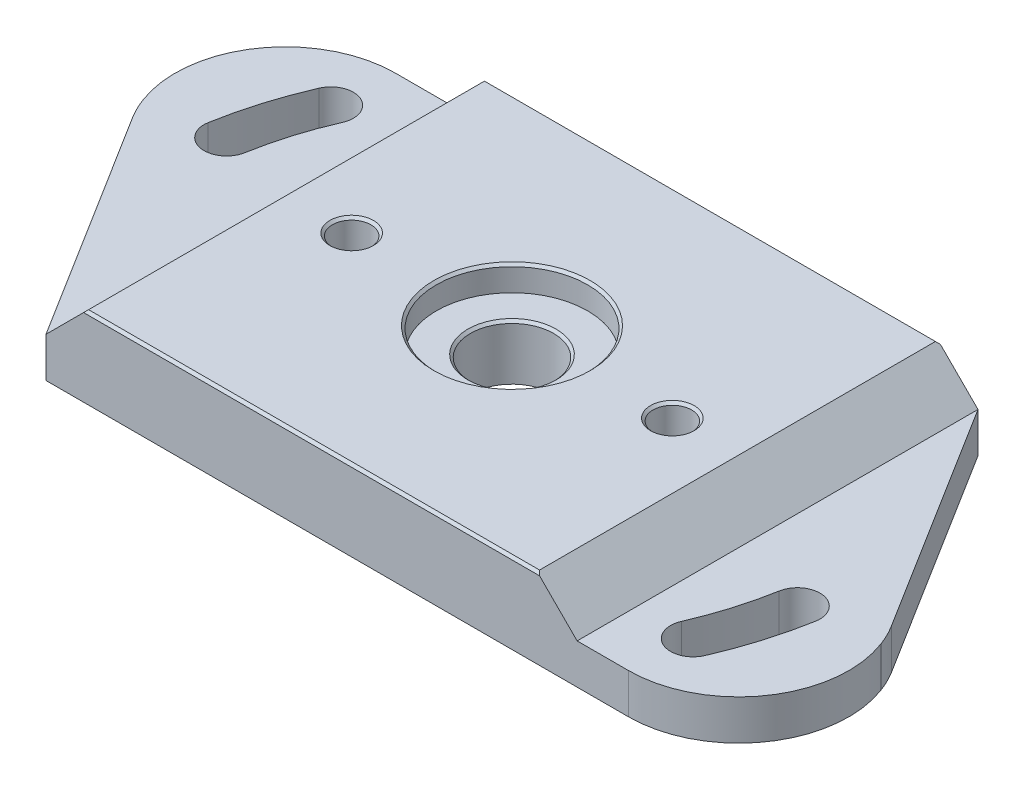
ISO-10303-21;
HEADER;
FILE_DESCRIPTION(('STEP AP214'),'2;1');
FILE_NAME('part.step','',(''),(''),'','','');
FILE_SCHEMA(('AUTOMOTIVE_DESIGN { 1 0 10303 214 1 1 1 1 }'));
ENDSEC;
DATA;
#1=APPLICATION_CONTEXT('core data for automotive mechanical design processes');
#2=APPLICATION_PROTOCOL_DEFINITION('international standard','automotive_design',2000,#1);
#3=PRODUCT_CONTEXT('',#1,'mechanical');
#4=PRODUCT('Part','Part','',(#3));
#5=PRODUCT_RELATED_PRODUCT_CATEGORY('part','',(#4));
#6=PRODUCT_DEFINITION_FORMATION('','',#4);
#7=PRODUCT_DEFINITION_CONTEXT('part definition',#1,'design');
#8=PRODUCT_DEFINITION('design','',#6,#7);
#9=PRODUCT_DEFINITION_SHAPE('','',#8);
#10=(LENGTH_UNIT() NAMED_UNIT(*) SI_UNIT(.MILLI.,.METRE.));
#11=(NAMED_UNIT(*) PLANE_ANGLE_UNIT() SI_UNIT($,.RADIAN.));
#12=(NAMED_UNIT(*) SI_UNIT($,.STERADIAN.) SOLID_ANGLE_UNIT());
#13=UNCERTAINTY_MEASURE_WITH_UNIT(LENGTH_MEASURE(1.E-05),#10,'distance_accuracy_value','');
#14=(GEOMETRIC_REPRESENTATION_CONTEXT(3) GLOBAL_UNCERTAINTY_ASSIGNED_CONTEXT((#13)) GLOBAL_UNIT_ASSIGNED_CONTEXT((#10,
#11,#12)) REPRESENTATION_CONTEXT('',''));
#15=CARTESIAN_POINT('',(0.,0.,0.));
#16=DIRECTION('',(0.,0.,1.));
#17=DIRECTION('',(1.,0.,0.));
#18=AXIS2_PLACEMENT_3D('',#15,#16,#17);
#19=CARTESIAN_POINT('',(0.,0.,0.));
#20=DIRECTION('',(0.,-1.,0.));
#21=DIRECTION('',(0.,0.,-1.));
#22=AXIS2_PLACEMENT_3D('',#19,#20,#21);
#23=PLANE('',#22);
#24=CARTESIAN_POINT('',(32.5,0.,-20.));
#25=DIRECTION('',(0.,-1.,0.));
#26=DIRECTION('',(0.,0.,-1.));
#27=AXIS2_PLACEMENT_3D('',#24,#25,#26);
#28=CIRCLE('',#27,4.14999999999999);
#29=CARTESIAN_POINT('',(32.5,0.,-24.15));
#30=VERTEX_POINT('',#29);
#31=EDGE_CURVE('E351',#30,#30,#28,.T.);
#32=ORIENTED_EDGE('',*,*,#31,.F.);
#33=EDGE_LOOP('',(#32));
#34=FACE_BOUND('',#33,.T.);
#35=CARTESIAN_POINT('',(32.5,0.,-20.));
#36=DIRECTION('',(0.,-1.,0.));
#37=DIRECTION('',(0.,0.,-1.));
#38=AXIS2_PLACEMENT_3D('',#35,#36,#37);
#39=CIRCLE('',#38,7.50000000000001);
#40=CARTESIAN_POINT('',(32.5,0.,-27.5));
#41=VERTEX_POINT('',#40);
#42=EDGE_CURVE('E209',#41,#41,#39,.T.);
#43=ORIENTED_EDGE('',*,*,#42,.T.);
#44=EDGE_LOOP('',(#43));
#45=FACE_BOUND('',#44,.T.);
#46=ADVANCED_FACE('F34',(#34,#45),#23,.T.);
#47=CARTESIAN_POINT('',(0.,4.,0.));
#48=DIRECTION('',(0.,-1.,0.));
#49=DIRECTION('',(0.,0.,-1.));
#50=AXIS2_PLACEMENT_3D('',#47,#48,#49);
#51=PLANE('',#50);
#52=CARTESIAN_POINT('',(-1.98187929913334,4.,-26.));
#53=DIRECTION('',(0.,1.,0.));
#54=DIRECTION('',(0.,0.,1.));
#55=AXIS2_PLACEMENT_3D('',#52,#53,#54);
#56=CIRCLE('',#55,2.25);
#57=CARTESIAN_POINT('',(-4.1985715397919,4.,-26.3857142857143));
#58=VERTEX_POINT('',#57);
#59=CARTESIAN_POINT('',(0.234812941525239,4.,-25.6142857142857));
#60=VERTEX_POINT('',#59);
#61=EDGE_CURVE('E363',#58,#60,#56,.T.);
#62=ORIENTED_EDGE('',*,*,#61,.F.);
#63=CARTESIAN_POINT('',(32.5,4.,-20.));
#64=DIRECTION('',(0.,1.,0.));
#65=DIRECTION('',(0.,0.,1.));
#66=AXIS2_PLACEMENT_3D('',#63,#64,#65);
#67=CIRCLE('',#66,37.25);
#68=CARTESIAN_POINT('',(-1.640188927421,4.,-34.9));
#69=VERTEX_POINT('',#68);
#70=EDGE_CURVE('E366',#69,#58,#67,.T.);
#71=ORIENTED_EDGE('',*,*,#70,.F.);
#72=CARTESIAN_POINT('',(0.42197013530912,4.,-34.));
#73=DIRECTION('',(0.,1.,0.));
#74=DIRECTION('',(0.,0.,1.));
#75=AXIS2_PLACEMENT_3D('',#72,#73,#74);
#76=CIRCLE('',#75,2.25);
#77=CARTESIAN_POINT('',(2.48412919803925,4.,-33.1));
#78=VERTEX_POINT('',#77);
#79=EDGE_CURVE('E369',#78,#69,#76,.T.);
#80=ORIENTED_EDGE('',*,*,#79,.F.);
#81=CARTESIAN_POINT('',(32.5,4.,-20.));
#82=DIRECTION('',(0.,-1.,0.));
#83=DIRECTION('',(0.,0.,1.));
#84=AXIS2_PLACEMENT_3D('',#81,#82,#83);
#85=CIRCLE('',#84,32.75);
#86=EDGE_CURVE('E360',#60,#78,#85,.T.);
#87=ORIENTED_EDGE('',*,*,#86,.F.);
#88=EDGE_LOOP('',(#62,#71,#80,#87));
#89=FACE_BOUND('',#88,.T.);
#90=DIRECTION('',(0.351123441588392,0.,0.936329177569044));
#91=VECTOR('',#90,1.);
#92=CARTESIAN_POINT('',(-15.,4.,-40.));
#93=LINE('',#92,#91);
#94=CARTESIAN_POINT('',(-9.42661580344789,4.,-25.1376421425277));
#95=VERTEX_POINT('',#94);
#96=CARTESIAN_POINT('',(-9.38719416359723,4.,-25.0325177695926));
#97=VERTEX_POINT('',#96);
#98=EDGE_CURVE('E228',#95,#97,#93,.T.);
#99=ORIENTED_EDGE('',*,*,#98,.T.);
#100=CARTESIAN_POINT('',(0.912426789662258,4.,-28.8948756270649));
#101=DIRECTION('',(0.,-1.,0.));
#102=DIRECTION('',(0.,0.,-1.));
#103=AXIS2_PLACEMENT_3D('',#100,#101,#102);
#104=CIRCLE('',#103,11.);
#105=CARTESIAN_POINT('',(-8.41555455439371,4.,-23.0648872870299));
#106=VERTEX_POINT('',#105);
#107=EDGE_CURVE('E56',#97,#106,#104,.F.);
#108=ORIENTED_EDGE('',*,*,#107,.T.);
#109=DIRECTION('',(-0.52999894000318,0.,-0.847998304005088));
#110=VECTOR('',#109,1.);
#111=CARTESIAN_POINT('',(6.00000000000001,4.,0.));
#112=LINE('',#111,#110);
#113=CARTESIAN_POINT('',(6.00000000000001,4.,0.));
#114=VERTEX_POINT('',#113);
#115=EDGE_CURVE('E198',#114,#106,#112,.T.);
#116=ORIENTED_EDGE('',*,*,#115,.F.);
#117=DIRECTION('',(0.,0.,-1.));
#118=VECTOR('',#117,1.);
#119=CARTESIAN_POINT('',(6.00000000000001,4.,-40.));
#120=LINE('',#119,#118);
#121=CARTESIAN_POINT('',(6.00000000000001,4.,-40.));
#122=VERTEX_POINT('',#121);
#123=EDGE_CURVE('E231',#114,#122,#120,.T.);
#124=ORIENTED_EDGE('',*,*,#123,.T.);
#125=DIRECTION('',(-1.,0.,0.));
#126=VECTOR('',#125,1.);
#127=CARTESIAN_POINT('',(-5.,4.,-40.));
#128=LINE('',#127,#126);
#129=CARTESIAN_POINT('',(0.873005149811592,4.,-40.));
#130=VERTEX_POINT('',#129);
#131=EDGE_CURVE('E232',#122,#130,#128,.T.);
#132=ORIENTED_EDGE('',*,*,#131,.T.);
#133=CARTESIAN_POINT('',(0.8730051498116,4.,-29.));
#134=DIRECTION('',(0.,-1.,0.));
#135=DIRECTION('',(0.,0.,-1.));
#136=AXIS2_PLACEMENT_3D('',#133,#134,#135);
#137=CIRCLE('',#136,11.);
#138=EDGE_CURVE('E311',#130,#95,#137,.F.);
#139=ORIENTED_EDGE('',*,*,#138,.T.);
#140=EDGE_LOOP('',(#99,#108,#116,#124,#132,#139));
#141=FACE_BOUND('',#140,.T.);
#142=ADVANCED_FACE('F316',(#89,#141),#51,.F.);
#143=CARTESIAN_POINT('',(66.9818792991333,4.,-14.));
#144=DIRECTION('',(0.,1.,0.));
#145=DIRECTION('',(0.,0.,1.));
#146=AXIS2_PLACEMENT_3D('',#143,#144,#145);
#147=CIRCLE('',#146,2.25);
#148=CARTESIAN_POINT('',(69.1985715397919,4.,-13.6142857142857));
#149=VERTEX_POINT('',#148);
#150=CARTESIAN_POINT('',(64.7651870584748,4.,-14.3857142857143));
#151=VERTEX_POINT('',#150);
#152=EDGE_CURVE('E397',#149,#151,#147,.T.);
#153=ORIENTED_EDGE('',*,*,#152,.F.);
#154=CARTESIAN_POINT('',(32.5,4.,-20.));
#155=DIRECTION('',(0.,1.,0.));
#156=DIRECTION('',(0.,0.,1.));
#157=AXIS2_PLACEMENT_3D('',#154,#155,#156);
#158=CIRCLE('',#157,37.25);
#159=CARTESIAN_POINT('',(66.640188927421,4.,-5.09999999999998));
#160=VERTEX_POINT('',#159);
#161=EDGE_CURVE('E400',#160,#149,#158,.T.);
#162=ORIENTED_EDGE('',*,*,#161,.F.);
#163=CARTESIAN_POINT('',(64.5780298646909,4.,-6.));
#164=DIRECTION('',(0.,1.,0.));
#165=DIRECTION('',(0.,0.,1.));
#166=AXIS2_PLACEMENT_3D('',#163,#164,#165);
#167=CIRCLE('',#166,2.25000000000001);
#168=CARTESIAN_POINT('',(62.5158708019608,4.,-6.89999999999999));
#169=VERTEX_POINT('',#168);
#170=EDGE_CURVE('E359',#169,#160,#167,.T.);
#171=ORIENTED_EDGE('',*,*,#170,.F.);
#172=CARTESIAN_POINT('',(32.5,4.,-20.));
#173=DIRECTION('',(0.,-1.,0.));
#174=DIRECTION('',(0.,0.,1.));
#175=AXIS2_PLACEMENT_3D('',#172,#173,#174);
#176=CIRCLE('',#175,32.75);
#177=EDGE_CURVE('E394',#151,#169,#176,.T.);
#178=ORIENTED_EDGE('',*,*,#177,.F.);
#179=EDGE_LOOP('',(#153,#162,#171,#178));
#180=FACE_BOUND('',#179,.T.);
#181=DIRECTION('',(-0.351123441588392,0.,-0.936329177569044));
#182=VECTOR('',#181,1.);
#183=CARTESIAN_POINT('',(80.,4.,0.));
#184=LINE('',#183,#182);
#185=CARTESIAN_POINT('',(74.4266158034479,4.,-14.8623578574723));
#186=VERTEX_POINT('',#185);
#187=CARTESIAN_POINT('',(74.3871941635973,4.,-14.9674822304073));
#188=VERTEX_POINT('',#187);
#189=EDGE_CURVE('E436',#186,#188,#184,.T.);
#190=ORIENTED_EDGE('',*,*,#189,.T.);
#191=CARTESIAN_POINT('',(64.0875732103378,4.,-11.105124372935));
#192=DIRECTION('',(0.,-1.,0.));
#193=DIRECTION('',(0.,0.,-1.));
#194=AXIS2_PLACEMENT_3D('',#191,#192,#193);
#195=CIRCLE('',#194,11.);
#196=CARTESIAN_POINT('',(73.4155545543937,4.,-16.93511271297));
#197=VERTEX_POINT('',#196);
#198=EDGE_CURVE('E294',#188,#197,#195,.F.);
#199=ORIENTED_EDGE('',*,*,#198,.T.);
#200=DIRECTION('',(0.52999894000318,0.,0.847998304005088));
#201=VECTOR('',#200,1.);
#202=CARTESIAN_POINT('',(74.,4.,-16.));
#203=LINE('',#202,#201);
#204=CARTESIAN_POINT('',(59.,4.,-40.));
#205=VERTEX_POINT('',#204);
#206=EDGE_CURVE('E338',#205,#197,#203,.T.);
#207=ORIENTED_EDGE('',*,*,#206,.F.);
#208=DIRECTION('',(0.,0.,1.));
#209=VECTOR('',#208,1.);
#210=CARTESIAN_POINT('',(59.,4.,0.));
#211=LINE('',#210,#209);
#212=CARTESIAN_POINT('',(59.,4.,0.));
#213=VERTEX_POINT('',#212);
#214=EDGE_CURVE('E229',#205,#213,#211,.T.);
#215=ORIENTED_EDGE('',*,*,#214,.T.);
#216=DIRECTION('',(1.,0.,0.));
#217=VECTOR('',#216,1.);
#218=CARTESIAN_POINT('',(60.,4.,0.));
#219=LINE('',#218,#217);
#220=CARTESIAN_POINT('',(64.1269948501884,4.,0.));
#221=VERTEX_POINT('',#220);
#222=EDGE_CURVE('E323',#213,#221,#219,.T.);
#223=ORIENTED_EDGE('',*,*,#222,.T.);
#224=CARTESIAN_POINT('',(64.1269948501884,4.,-11.));
#225=DIRECTION('',(0.,-1.,0.));
#226=DIRECTION('',(0.,0.,-1.));
#227=AXIS2_PLACEMENT_3D('',#224,#225,#226);
#228=CIRCLE('',#227,11.);
#229=EDGE_CURVE('E292',#221,#186,#228,.F.);
#230=ORIENTED_EDGE('',*,*,#229,.T.);
#231=EDGE_LOOP('',(#190,#199,#207,#215,#223,#230));
#232=FACE_BOUND('',#231,.T.);
#233=ADVANCED_FACE('F440',(#180,#232),#51,.F.);
#234=CARTESIAN_POINT('',(-15.,4.,-40.));
#235=DIRECTION('',(0.936329177569045,0.,-0.351123441588392));
#236=DIRECTION('',(-0.351123441588392,0.,-0.936329177569045));
#237=AXIS2_PLACEMENT_3D('',#234,#235,#236);
#238=PLANE('',#237);
#239=DIRECTION('',(0.351123441588392,0.,0.936329177569044));
#240=VECTOR('',#239,1.);
#241=CARTESIAN_POINT('',(-15.,0.,-40.));
#242=LINE('',#241,#240);
#243=CARTESIAN_POINT('',(-9.42661580344789,0.,-25.1376421425277));
#244=VERTEX_POINT('',#243);
#245=CARTESIAN_POINT('',(-9.38719416359723,0.,-25.0325177695926));
#246=VERTEX_POINT('',#245);
#247=EDGE_CURVE('E217',#244,#246,#242,.T.);
#248=ORIENTED_EDGE('',*,*,#247,.T.);
#249=DIRECTION('',(0.,1.,0.));
#250=VECTOR('',#249,1.);
#251=CARTESIAN_POINT('',(-9.38719416359723,4.,-25.0325177695926));
#252=LINE('',#251,#250);
#253=EDGE_CURVE('E308',#246,#97,#252,.T.);
#254=ORIENTED_EDGE('',*,*,#253,.T.);
#255=ORIENTED_EDGE('',*,*,#98,.F.);
#256=DIRECTION('',(0.,-1.,0.));
#257=VECTOR('',#256,1.);
#258=CARTESIAN_POINT('',(-9.42661580344789,4.,-25.1376421425277));
#259=LINE('',#258,#257);
#260=EDGE_CURVE('E305',#95,#244,#259,.T.);
#261=ORIENTED_EDGE('',*,*,#260,.T.);
#262=EDGE_LOOP('',(#248,#254,#255,#261));
#263=FACE_BOUND('',#262,.T.);
#264=ADVANCED_FACE('F320',(#263),#238,.F.);
#265=CARTESIAN_POINT('',(60.,4.,0.));
#266=DIRECTION('',(0.,0.,-1.));
#267=DIRECTION('',(-1.,0.,0.));
#268=AXIS2_PLACEMENT_3D('',#265,#266,#267);
#269=PLANE('',#268);
#270=DIRECTION('',(1.,0.,0.));
#271=VECTOR('',#270,1.);
#272=CARTESIAN_POINT('',(60.,0.,0.));
#273=LINE('',#272,#271);
#274=CARTESIAN_POINT('',(6.00000000000001,0.,0.));
#275=VERTEX_POINT('',#274);
#276=CARTESIAN_POINT('',(64.1269948501884,0.,0.));
#277=VERTEX_POINT('',#276);
#278=EDGE_CURVE('E204',#275,#277,#273,.T.);
#279=ORIENTED_EDGE('',*,*,#278,.T.);
#280=DIRECTION('',(0.,-1.,0.));
#281=VECTOR('',#280,1.);
#282=CARTESIAN_POINT('',(64.1269948501884,4.,0.));
#283=LINE('',#282,#281);
#284=EDGE_CURVE('E11',#277,#221,#283,.F.);
#285=ORIENTED_EDGE('',*,*,#284,.T.);
#286=ORIENTED_EDGE('',*,*,#222,.F.);
#287=DIRECTION('',(0.707106781186548,-0.707106781186547,0.));
#288=VECTOR('',#287,1.);
#289=CARTESIAN_POINT('',(59.5,3.50000000000001,0.));
#290=LINE('',#289,#288);
#291=CARTESIAN_POINT('',(55.25,7.74999999999999,0.));
#292=VERTEX_POINT('',#291);
#293=EDGE_CURVE('E237',#213,#292,#290,.F.);
#294=ORIENTED_EDGE('',*,*,#293,.T.);
#295=DIRECTION('',(-1.,0.,0.));
#296=VECTOR('',#295,1.);
#297=CARTESIAN_POINT('',(10.,7.74999999999999,0.));
#298=LINE('',#297,#296);
#299=CARTESIAN_POINT('',(9.74999999999999,7.74999999999998,0.));
#300=VERTEX_POINT('',#299);
#301=EDGE_CURVE('E278',#292,#300,#298,.T.);
#302=ORIENTED_EDGE('',*,*,#301,.T.);
#303=DIRECTION('',(0.707106781186547,0.707106781186548,0.));
#304=VECTOR('',#303,1.);
#305=CARTESIAN_POINT('',(32.9999999999999,31.,0.));
#306=LINE('',#305,#304);
#307=EDGE_CURVE('E207',#300,#114,#306,.F.);
#308=ORIENTED_EDGE('',*,*,#307,.T.);
#309=DIRECTION('',(0.,1.,0.));
#310=VECTOR('',#309,1.);
#311=CARTESIAN_POINT('',(6.00000000000001,0.,0.));
#312=LINE('',#311,#310);
#313=EDGE_CURVE('E192',#275,#114,#312,.T.);
#314=ORIENTED_EDGE('',*,*,#313,.F.);
#315=EDGE_LOOP('',(#279,#285,#286,#294,#302,#308,#314));
#316=FACE_BOUND('',#315,.T.);
#317=ADVANCED_FACE('F203',(#316),#269,.F.);
#318=CARTESIAN_POINT('',(80.,4.,0.));
#319=DIRECTION('',(-0.936329177569044,0.,0.351123441588392));
#320=DIRECTION('',(0.351123441588392,0.,0.936329177569044));
#321=AXIS2_PLACEMENT_3D('',#318,#319,#320);
#322=PLANE('',#321);
#323=DIRECTION('',(-0.351123441588392,0.,-0.936329177569044));
#324=VECTOR('',#323,1.);
#325=CARTESIAN_POINT('',(80.,0.,0.));
#326=LINE('',#325,#324);
#327=CARTESIAN_POINT('',(74.4266158034479,0.,-14.8623578574723));
#328=VERTEX_POINT('',#327);
#329=CARTESIAN_POINT('',(74.3871941635973,0.,-14.9674822304073));
#330=VERTEX_POINT('',#329);
#331=EDGE_CURVE('E216',#328,#330,#326,.T.);
#332=ORIENTED_EDGE('',*,*,#331,.T.);
#333=DIRECTION('',(0.,1.,0.));
#334=VECTOR('',#333,1.);
#335=CARTESIAN_POINT('',(74.3871941635973,4.,-14.9674822304073));
#336=LINE('',#335,#334);
#337=EDGE_CURVE('E289',#330,#188,#336,.T.);
#338=ORIENTED_EDGE('',*,*,#337,.T.);
#339=ORIENTED_EDGE('',*,*,#189,.F.);
#340=DIRECTION('',(0.,-1.,0.));
#341=VECTOR('',#340,1.);
#342=CARTESIAN_POINT('',(74.4266158034479,4.,-14.8623578574723));
#343=LINE('',#342,#341);
#344=EDGE_CURVE('E286',#186,#328,#343,.T.);
#345=ORIENTED_EDGE('',*,*,#344,.T.);
#346=EDGE_LOOP('',(#332,#338,#339,#345));
#347=FACE_BOUND('',#346,.T.);
#348=ADVANCED_FACE('F444',(#347),#322,.F.);
#349=CARTESIAN_POINT('',(-5.,4.,-40.));
#350=DIRECTION('',(0.,0.,1.));
#351=DIRECTION('',(1.,0.,0.));
#352=AXIS2_PLACEMENT_3D('',#349,#350,#351);
#353=PLANE('',#352);
#354=DIRECTION('',(-1.,0.,0.));
#355=VECTOR('',#354,1.);
#356=CARTESIAN_POINT('',(-5.,0.,-40.));
#357=LINE('',#356,#355);
#358=CARTESIAN_POINT('',(59.,0.,-40.));
#359=VERTEX_POINT('',#358);
#360=CARTESIAN_POINT('',(0.873005149811592,0.,-40.));
#361=VERTEX_POINT('',#360);
#362=EDGE_CURVE('E220',#359,#361,#357,.T.);
#363=ORIENTED_EDGE('',*,*,#362,.T.);
#364=DIRECTION('',(0.,-1.,0.));
#365=VECTOR('',#364,1.);
#366=CARTESIAN_POINT('',(0.873005149811592,4.,-40.));
#367=LINE('',#366,#365);
#368=EDGE_CURVE('E42',#361,#130,#367,.F.);
#369=ORIENTED_EDGE('',*,*,#368,.T.);
#370=ORIENTED_EDGE('',*,*,#131,.F.);
#371=DIRECTION('',(-0.707106781186547,-0.707106781186548,0.));
#372=VECTOR('',#371,1.);
#373=CARTESIAN_POINT('',(0.500000000000014,-1.5,-40.));
#374=LINE('',#373,#372);
#375=CARTESIAN_POINT('',(9.74999999999996,7.74999999999996,-40.));
#376=VERTEX_POINT('',#375);
#377=EDGE_CURVE('E241',#122,#376,#374,.F.);
#378=ORIENTED_EDGE('',*,*,#377,.T.);
#379=DIRECTION('',(1.,0.,0.));
#380=VECTOR('',#379,1.);
#381=CARTESIAN_POINT('',(55.,7.74999999999996,-40.));
#382=LINE('',#381,#380);
#383=CARTESIAN_POINT('',(55.25,7.74999999999995,-40.));
#384=VERTEX_POINT('',#383);
#385=EDGE_CURVE('E284',#376,#384,#382,.T.);
#386=ORIENTED_EDGE('',*,*,#385,.T.);
#387=DIRECTION('',(-0.707106781186548,0.707106781186547,0.));
#388=VECTOR('',#387,1.);
#389=CARTESIAN_POINT('',(26.9999999999999,36.,-40.));
#390=LINE('',#389,#388);
#391=EDGE_CURVE('E234',#384,#205,#390,.F.);
#392=ORIENTED_EDGE('',*,*,#391,.T.);
#393=DIRECTION('',(0.,1.,0.));
#394=VECTOR('',#393,1.);
#395=CARTESIAN_POINT('',(59.,0.,-40.));
#396=LINE('',#395,#394);
#397=EDGE_CURVE('E329',#359,#205,#396,.T.);
#398=ORIENTED_EDGE('',*,*,#397,.F.);
#399=EDGE_LOOP('',(#363,#369,#370,#378,#386,#392,#398));
#400=FACE_BOUND('',#399,.T.);
#401=ADVANCED_FACE('F328',(#400),#353,.F.);
#402=DIRECTION('',(0.52999894000318,0.,0.847998304005088));
#403=VECTOR('',#402,1.);
#404=CARTESIAN_POINT('',(74.,0.,-16.));
#405=LINE('',#404,#403);
#406=CARTESIAN_POINT('',(73.4155545543937,0.,-16.93511271297));
#407=VERTEX_POINT('',#406);
#408=EDGE_CURVE('E335',#359,#407,#405,.T.);
#409=ORIENTED_EDGE('',*,*,#408,.T.);
#410=CARTESIAN_POINT('',(64.0875732103378,0.,-11.105124372935));
#411=DIRECTION('',(0.,-1.,0.));
#412=DIRECTION('',(0.,0.,-1.));
#413=AXIS2_PLACEMENT_3D('',#410,#411,#412);
#414=CIRCLE('',#413,11.);
#415=EDGE_CURVE('E303',#407,#330,#414,.T.);
#416=ORIENTED_EDGE('',*,*,#415,.T.);
#417=ORIENTED_EDGE('',*,*,#331,.F.);
#418=CARTESIAN_POINT('',(64.1269948501884,0.,-11.));
#419=DIRECTION('',(0.,-1.,0.));
#420=DIRECTION('',(0.,0.,-1.));
#421=AXIS2_PLACEMENT_3D('',#418,#419,#420);
#422=CIRCLE('',#421,11.);
#423=EDGE_CURVE('E215',#328,#277,#422,.T.);
#424=ORIENTED_EDGE('',*,*,#423,.T.);
#425=ORIENTED_EDGE('',*,*,#278,.F.);
#426=DIRECTION('',(-0.52999894000318,0.,-0.847998304005088));
#427=VECTOR('',#426,1.);
#428=CARTESIAN_POINT('',(6.00000000000001,0.,0.));
#429=LINE('',#428,#427);
#430=CARTESIAN_POINT('',(-8.41555455439371,0.,-23.0648872870299));
#431=VERTEX_POINT('',#430);
#432=EDGE_CURVE('E189',#275,#431,#429,.T.);
#433=ORIENTED_EDGE('',*,*,#432,.T.);
#434=CARTESIAN_POINT('',(0.912426789662258,0.,-28.8948756270649));
#435=DIRECTION('',(0.,-1.,0.));
#436=DIRECTION('',(0.,0.,-1.));
#437=AXIS2_PLACEMENT_3D('',#434,#435,#436);
#438=CIRCLE('',#437,11.);
#439=EDGE_CURVE('E301',#431,#246,#438,.T.);
#440=ORIENTED_EDGE('',*,*,#439,.T.);
#441=ORIENTED_EDGE('',*,*,#247,.F.);
#442=CARTESIAN_POINT('',(0.8730051498116,0.,-29.));
#443=DIRECTION('',(0.,-1.,0.));
#444=DIRECTION('',(0.,0.,-1.));
#445=AXIS2_PLACEMENT_3D('',#442,#443,#444);
#446=CIRCLE('',#445,11.);
#447=EDGE_CURVE('E299',#244,#361,#446,.T.);
#448=ORIENTED_EDGE('',*,*,#447,.T.);
#449=ORIENTED_EDGE('',*,*,#362,.F.);
#450=EDGE_LOOP('',(#409,#416,#417,#424,#425,#433,#440,#441,#448,#449));
#451=FACE_BOUND('',#450,.T.);
#452=CARTESIAN_POINT('',(32.5,0.,-20.));
#453=DIRECTION('',(0.,-1.,0.));
#454=DIRECTION('',(0.,0.,-1.));
#455=AXIS2_PLACEMENT_3D('',#452,#453,#454);
#456=CIRCLE('',#455,9.99999999999998);
#457=CARTESIAN_POINT('',(32.5,0.,-30.));
#458=VERTEX_POINT('',#457);
#459=EDGE_CURVE('E345',#458,#458,#456,.T.);
#460=ORIENTED_EDGE('',*,*,#459,.F.);
#461=EDGE_LOOP('',(#460));
#462=FACE_BOUND('',#461,.T.);
#463=CARTESIAN_POINT('',(32.5,0.,-20.));
#464=DIRECTION('',(0.,-1.,0.));
#465=DIRECTION('',(0.,0.,-1.));
#466=AXIS2_PLACEMENT_3D('',#463,#464,#465);
#467=CIRCLE('',#466,37.25);
#468=CARTESIAN_POINT('',(-1.64018892742101,0.,-34.9));
#469=VERTEX_POINT('',#468);
#470=CARTESIAN_POINT('',(-4.1985715397919,0.,-26.3857142857143));
#471=VERTEX_POINT('',#470);
#472=EDGE_CURVE('E362',#469,#471,#467,.F.);
#473=ORIENTED_EDGE('',*,*,#472,.T.);
#474=CARTESIAN_POINT('',(-1.98187929913334,0.,-26.));
#475=DIRECTION('',(0.,-1.,0.));
#476=DIRECTION('',(0.,0.,-1.));
#477=AXIS2_PLACEMENT_3D('',#474,#475,#476);
#478=CIRCLE('',#477,2.25);
#479=CARTESIAN_POINT('',(0.234812941525239,0.,-25.6142857142857));
#480=VERTEX_POINT('',#479);
#481=EDGE_CURVE('E385',#471,#480,#478,.F.);
#482=ORIENTED_EDGE('',*,*,#481,.T.);
#483=CARTESIAN_POINT('',(32.5,0.,-20.));
#484=DIRECTION('',(0.,-1.,0.));
#485=DIRECTION('',(0.,0.,-1.));
#486=AXIS2_PLACEMENT_3D('',#483,#484,#485);
#487=CIRCLE('',#486,32.75);
#488=CARTESIAN_POINT('',(2.48412919803926,0.,-33.1));
#489=VERTEX_POINT('',#488);
#490=EDGE_CURVE('E381',#480,#489,#487,.T.);
#491=ORIENTED_EDGE('',*,*,#490,.T.);
#492=CARTESIAN_POINT('',(0.42197013530912,0.,-34.));
#493=DIRECTION('',(0.,-1.,0.));
#494=DIRECTION('',(0.,0.,-1.));
#495=AXIS2_PLACEMENT_3D('',#492,#493,#494);
#496=CIRCLE('',#495,2.25);
#497=EDGE_CURVE('E376',#489,#469,#496,.F.);
#498=ORIENTED_EDGE('',*,*,#497,.T.);
#499=EDGE_LOOP('',(#473,#482,#491,#498));
#500=FACE_BOUND('',#499,.T.);
#501=CARTESIAN_POINT('',(32.5,0.,-20.));
#502=DIRECTION('',(0.,-1.,0.));
#503=DIRECTION('',(0.,0.,-1.));
#504=AXIS2_PLACEMENT_3D('',#501,#502,#503);
#505=CIRCLE('',#504,37.25);
#506=CARTESIAN_POINT('',(66.640188927421,0.,-5.09999999999998));
#507=VERTEX_POINT('',#506);
#508=CARTESIAN_POINT('',(69.1985715397919,0.,-13.6142857142857));
#509=VERTEX_POINT('',#508);
#510=EDGE_CURVE('E396',#507,#509,#505,.F.);
#511=ORIENTED_EDGE('',*,*,#510,.T.);
#512=CARTESIAN_POINT('',(66.9818792991333,0.,-14.));
#513=DIRECTION('',(0.,-1.,0.));
#514=DIRECTION('',(0.,0.,-1.));
#515=AXIS2_PLACEMENT_3D('',#512,#513,#514);
#516=CIRCLE('',#515,2.25);
#517=CARTESIAN_POINT('',(64.7651870584748,0.,-14.3857142857143));
#518=VERTEX_POINT('',#517);
#519=EDGE_CURVE('E416',#509,#518,#516,.F.);
#520=ORIENTED_EDGE('',*,*,#519,.T.);
#521=CARTESIAN_POINT('',(32.5,0.,-20.));
#522=DIRECTION('',(0.,-1.,0.));
#523=DIRECTION('',(0.,0.,-1.));
#524=AXIS2_PLACEMENT_3D('',#521,#522,#523);
#525=CIRCLE('',#524,32.75);
#526=CARTESIAN_POINT('',(62.5158708019608,0.,-6.89999999999999));
#527=VERTEX_POINT('',#526);
#528=EDGE_CURVE('E412',#518,#527,#525,.T.);
#529=ORIENTED_EDGE('',*,*,#528,.T.);
#530=CARTESIAN_POINT('',(64.5780298646909,0.,-6.));
#531=DIRECTION('',(0.,-1.,0.));
#532=DIRECTION('',(0.,0.,-1.));
#533=AXIS2_PLACEMENT_3D('',#530,#531,#532);
#534=CIRCLE('',#533,2.25000000000001);
#535=EDGE_CURVE('E408',#527,#507,#534,.F.);
#536=ORIENTED_EDGE('',*,*,#535,.T.);
#537=EDGE_LOOP('',(#511,#520,#529,#536));
#538=FACE_BOUND('',#537,.T.);
#539=CARTESIAN_POINT('',(48.5,0.,-20.));
#540=DIRECTION('',(0.,-1.,0.));
#541=DIRECTION('',(0.,0.,-1.));
#542=AXIS2_PLACEMENT_3D('',#539,#540,#541);
#543=CIRCLE('',#542,1.925);
#544=CARTESIAN_POINT('',(48.5,0.,-21.925));
#545=VERTEX_POINT('',#544);
#546=EDGE_CURVE('E424',#545,#545,#543,.F.);
#547=ORIENTED_EDGE('',*,*,#546,.T.);
#548=EDGE_LOOP('',(#547));
#549=FACE_BOUND('',#548,.T.);
#550=CARTESIAN_POINT('',(16.5,0.,-20.));
#551=DIRECTION('',(0.,-1.,0.));
#552=DIRECTION('',(0.,0.,-1.));
#553=AXIS2_PLACEMENT_3D('',#550,#551,#552);
#554=CIRCLE('',#553,1.925);
#555=CARTESIAN_POINT('',(16.5,0.,-21.925));
#556=VERTEX_POINT('',#555);
#557=EDGE_CURVE('E393',#556,#556,#554,.F.);
#558=ORIENTED_EDGE('',*,*,#557,.T.);
#559=EDGE_LOOP('',(#558));
#560=FACE_BOUND('',#559,.T.);
#561=ADVANCED_FACE('F212',(#451,#462,#500,#538,#549,#560),#23,.T.);
#562=CARTESIAN_POINT('',(0.,8.,0.));
#563=DIRECTION('',(0.,1.,0.));
#564=DIRECTION('',(0.,0.,1.));
#565=AXIS2_PLACEMENT_3D('',#562,#563,#564);
#566=PLANE('',#565);
#567=CARTESIAN_POINT('',(48.5,8.,-20.));
#568=DIRECTION('',(0.,1.,0.));
#569=DIRECTION('',(0.,0.,1.));
#570=AXIS2_PLACEMENT_3D('',#567,#568,#569);
#571=CIRCLE('',#570,2.17500000000001);
#572=CARTESIAN_POINT('',(48.5,8.,-17.825));
#573=VERTEX_POINT('',#572);
#574=EDGE_CURVE('E265',#573,#573,#571,.F.);
#575=ORIENTED_EDGE('',*,*,#574,.T.);
#576=EDGE_LOOP('',(#575));
#577=FACE_BOUND('',#576,.T.);
#578=CARTESIAN_POINT('',(16.5,8.,-20.));
#579=DIRECTION('',(0.,1.,0.));
#580=DIRECTION('',(0.,0.,1.));
#581=AXIS2_PLACEMENT_3D('',#578,#579,#580);
#582=CIRCLE('',#581,2.17500000000001);
#583=CARTESIAN_POINT('',(16.5,8.,-17.825));
#584=VERTEX_POINT('',#583);
#585=EDGE_CURVE('E262',#584,#584,#582,.F.);
#586=ORIENTED_EDGE('',*,*,#585,.T.);
#587=EDGE_LOOP('',(#586));
#588=FACE_BOUND('',#587,.T.);
#589=CARTESIAN_POINT('',(32.5,8.,-20.));
#590=DIRECTION('',(0.,1.,0.));
#591=DIRECTION('',(0.,0.,1.));
#592=AXIS2_PLACEMENT_3D('',#589,#590,#591);
#593=CIRCLE('',#592,7.7999999999999);
#594=CARTESIAN_POINT('',(32.5,8.,-12.2000000000001));
#595=VERTEX_POINT('',#594);
#596=EDGE_CURVE('E259',#595,#595,#593,.F.);
#597=ORIENTED_EDGE('',*,*,#596,.T.);
#598=EDGE_LOOP('',(#597));
#599=FACE_BOUND('',#598,.T.);
#600=DIRECTION('',(0.,0.,1.));
#601=VECTOR('',#600,1.);
#602=CARTESIAN_POINT('',(9.99999999999999,8.,-40.));
#603=LINE('',#602,#601);
#604=CARTESIAN_POINT('',(9.99999999999999,8.,-39.75));
#605=VERTEX_POINT('',#604);
#606=CARTESIAN_POINT('',(10.,8.,-0.250000000000014));
#607=VERTEX_POINT('',#606);
#608=EDGE_CURVE('E427',#605,#607,#603,.T.);
#609=ORIENTED_EDGE('',*,*,#608,.T.);
#610=DIRECTION('',(1.,0.,0.));
#611=VECTOR('',#610,1.);
#612=CARTESIAN_POINT('',(55.,8.,-0.250000000000014));
#613=LINE('',#612,#611);
#614=CARTESIAN_POINT('',(55.,8.,-0.250000000000014));
#615=VERTEX_POINT('',#614);
#616=EDGE_CURVE('E256',#607,#615,#613,.T.);
#617=ORIENTED_EDGE('',*,*,#616,.T.);
#618=DIRECTION('',(0.,0.,-1.));
#619=VECTOR('',#618,1.);
#620=CARTESIAN_POINT('',(55.,8.,-40.));
#621=LINE('',#620,#619);
#622=CARTESIAN_POINT('',(55.,8.,-39.75));
#623=VERTEX_POINT('',#622);
#624=EDGE_CURVE('E223',#615,#623,#621,.T.);
#625=ORIENTED_EDGE('',*,*,#624,.T.);
#626=DIRECTION('',(-1.,0.,0.));
#627=VECTOR('',#626,1.);
#628=CARTESIAN_POINT('',(9.99999999999999,8.,-39.75));
#629=LINE('',#628,#627);
#630=EDGE_CURVE('E253',#623,#605,#629,.T.);
#631=ORIENTED_EDGE('',*,*,#630,.T.);
#632=EDGE_LOOP('',(#609,#617,#625,#631));
#633=FACE_BOUND('',#632,.T.);
#634=ADVANCED_FACE('F462',(#577,#588,#599,#633),#566,.T.);
#635=CARTESIAN_POINT('',(16.5,-5.44472221513642,-20.));
#636=DIRECTION('',(0.,1.,0.));
#637=DIRECTION('',(0.,0.,1.));
#638=AXIS2_PLACEMENT_3D('',#635,#636,#637);
#639=CYLINDRICAL_SURFACE('',#638,1.925);
#640=CARTESIAN_POINT('',(16.5,7.75,-20.));
#641=DIRECTION('',(0.,1.,0.));
#642=DIRECTION('',(0.,0.,1.));
#643=AXIS2_PLACEMENT_3D('',#640,#641,#642);
#644=CIRCLE('',#643,1.925);
#645=CARTESIAN_POINT('',(16.5,7.75,-18.075));
#646=VERTEX_POINT('',#645);
#647=EDGE_CURVE('E268',#646,#646,#644,.T.);
#648=ORIENTED_EDGE('',*,*,#647,.T.);
#649=EDGE_LOOP('',(#648));
#650=FACE_BOUND('',#649,.T.);
#651=ORIENTED_EDGE('',*,*,#557,.F.);
#652=EDGE_LOOP('',(#651));
#653=FACE_BOUND('',#652,.T.);
#654=ADVANCED_FACE('F495',(#650,#653),#639,.F.);
#655=CARTESIAN_POINT('',(48.5,-5.44472221513642,-20.));
#656=DIRECTION('',(0.,1.,0.));
#657=DIRECTION('',(0.,0.,1.));
#658=AXIS2_PLACEMENT_3D('',#655,#656,#657);
#659=CYLINDRICAL_SURFACE('',#658,1.925);
#660=CARTESIAN_POINT('',(48.5,7.75,-20.));
#661=DIRECTION('',(0.,1.,0.));
#662=DIRECTION('',(0.,0.,1.));
#663=AXIS2_PLACEMENT_3D('',#660,#661,#662);
#664=CIRCLE('',#663,1.925);
#665=CARTESIAN_POINT('',(48.5,7.75,-18.075));
#666=VERTEX_POINT('',#665);
#667=EDGE_CURVE('E250',#666,#666,#664,.T.);
#668=ORIENTED_EDGE('',*,*,#667,.T.);
#669=EDGE_LOOP('',(#668));
#670=FACE_BOUND('',#669,.T.);
#671=ORIENTED_EDGE('',*,*,#546,.F.);
#672=EDGE_LOOP('',(#671));
#673=FACE_BOUND('',#672,.T.);
#674=ADVANCED_FACE('F619',(#670,#673),#659,.F.);
#675=CARTESIAN_POINT('',(32.5,-14.2798157205705,-20.));
#676=DIRECTION('',(0.,1.,0.));
#677=DIRECTION('',(0.,0.,1.));
#678=AXIS2_PLACEMENT_3D('',#675,#676,#677);
#679=CYLINDRICAL_SURFACE('',#678,37.25);
#680=DIRECTION('',(0.,1.,0.));
#681=VECTOR('',#680,1.);
#682=CARTESIAN_POINT('',(66.640188927421,-14.2798157205705,-5.09999999999998));
#683=LINE('',#682,#681);
#684=EDGE_CURVE('E372',#507,#160,#683,.T.);
#685=ORIENTED_EDGE('',*,*,#684,.T.);
#686=ORIENTED_EDGE('',*,*,#161,.T.);
#687=DIRECTION('',(0.,1.,0.));
#688=VECTOR('',#687,1.);
#689=CARTESIAN_POINT('',(69.1985715397919,-14.2798157205705,-13.6142857142857));
#690=LINE('',#689,#688);
#691=EDGE_CURVE('E407',#509,#149,#690,.T.);
#692=ORIENTED_EDGE('',*,*,#691,.F.);
#693=ORIENTED_EDGE('',*,*,#510,.F.);
#694=EDGE_LOOP('',(#685,#686,#692,#693));
#695=FACE_BOUND('',#694,.T.);
#696=ADVANCED_FACE('F615',(#695),#679,.F.);
#697=CARTESIAN_POINT('',(66.9818792991333,-14.2798157205705,-14.));
#698=DIRECTION('',(0.,1.,0.));
#699=DIRECTION('',(0.,0.,1.));
#700=AXIS2_PLACEMENT_3D('',#697,#698,#699);
#701=CYLINDRICAL_SURFACE('',#700,2.25);
#702=ORIENTED_EDGE('',*,*,#691,.T.);
#703=ORIENTED_EDGE('',*,*,#152,.T.);
#704=DIRECTION('',(0.,1.,0.));
#705=VECTOR('',#704,1.);
#706=CARTESIAN_POINT('',(64.7651870584748,-14.2798157205705,-14.3857142857143));
#707=LINE('',#706,#705);
#708=EDGE_CURVE('E415',#518,#151,#707,.T.);
#709=ORIENTED_EDGE('',*,*,#708,.F.);
#710=ORIENTED_EDGE('',*,*,#519,.F.);
#711=EDGE_LOOP('',(#702,#703,#709,#710));
#712=FACE_BOUND('',#711,.T.);
#713=ADVANCED_FACE('F611',(#712),#701,.F.);
#714=CARTESIAN_POINT('',(32.5,-14.2798157205705,-20.));
#715=DIRECTION('',(0.,1.,0.));
#716=DIRECTION('',(0.,0.,1.));
#717=AXIS2_PLACEMENT_3D('',#714,#715,#716);
#718=CYLINDRICAL_SURFACE('',#717,32.75);
#719=ORIENTED_EDGE('',*,*,#708,.T.);
#720=ORIENTED_EDGE('',*,*,#177,.T.);
#721=DIRECTION('',(0.,1.,0.));
#722=VECTOR('',#721,1.);
#723=CARTESIAN_POINT('',(62.5158708019608,-14.2798157205705,-6.89999999999999));
#724=LINE('',#723,#722);
#725=EDGE_CURVE('E411',#527,#169,#724,.T.);
#726=ORIENTED_EDGE('',*,*,#725,.F.);
#727=ORIENTED_EDGE('',*,*,#528,.F.);
#728=EDGE_LOOP('',(#719,#720,#726,#727));
#729=FACE_BOUND('',#728,.T.);
#730=ADVANCED_FACE('F607',(#729),#718,.T.);
#731=CARTESIAN_POINT('',(64.5780298646909,-14.2798157205705,-6.));
#732=DIRECTION('',(0.,1.,0.));
#733=DIRECTION('',(0.,0.,1.));
#734=AXIS2_PLACEMENT_3D('',#731,#732,#733);
#735=CYLINDRICAL_SURFACE('',#734,2.25000000000001);
#736=ORIENTED_EDGE('',*,*,#725,.T.);
#737=ORIENTED_EDGE('',*,*,#170,.T.);
#738=ORIENTED_EDGE('',*,*,#684,.F.);
#739=ORIENTED_EDGE('',*,*,#535,.F.);
#740=EDGE_LOOP('',(#736,#737,#738,#739));
#741=FACE_BOUND('',#740,.T.);
#742=ADVANCED_FACE('F603',(#741),#735,.F.);
#743=CARTESIAN_POINT('',(32.5,-14.2798157205705,-20.));
#744=DIRECTION('',(0.,1.,0.));
#745=DIRECTION('',(0.,0.,1.));
#746=AXIS2_PLACEMENT_3D('',#743,#744,#745);
#747=CYLINDRICAL_SURFACE('',#746,37.25);
#748=DIRECTION('',(0.,1.,0.));
#749=VECTOR('',#748,1.);
#750=CARTESIAN_POINT('',(-1.640188927421,-14.2798157205705,-34.9));
#751=LINE('',#750,#749);
#752=EDGE_CURVE('E379',#469,#69,#751,.T.);
#753=ORIENTED_EDGE('',*,*,#752,.T.);
#754=ORIENTED_EDGE('',*,*,#70,.T.);
#755=DIRECTION('',(0.,1.,0.));
#756=VECTOR('',#755,1.);
#757=CARTESIAN_POINT('',(-4.1985715397919,-14.2798157205705,-26.3857142857143));
#758=LINE('',#757,#756);
#759=EDGE_CURVE('E375',#471,#58,#758,.T.);
#760=ORIENTED_EDGE('',*,*,#759,.F.);
#761=ORIENTED_EDGE('',*,*,#472,.F.);
#762=EDGE_LOOP('',(#753,#754,#760,#761));
#763=FACE_BOUND('',#762,.T.);
#764=ADVANCED_FACE('F599',(#763),#747,.F.);
#765=CARTESIAN_POINT('',(-1.98187929913334,-14.2798157205705,-26.));
#766=DIRECTION('',(0.,1.,0.));
#767=DIRECTION('',(0.,0.,1.));
#768=AXIS2_PLACEMENT_3D('',#765,#766,#767);
#769=CYLINDRICAL_SURFACE('',#768,2.25);
#770=ORIENTED_EDGE('',*,*,#759,.T.);
#771=ORIENTED_EDGE('',*,*,#61,.T.);
#772=DIRECTION('',(0.,1.,0.));
#773=VECTOR('',#772,1.);
#774=CARTESIAN_POINT('',(0.234812941525239,-14.2798157205705,-25.6142857142857));
#775=LINE('',#774,#773);
#776=EDGE_CURVE('E384',#480,#60,#775,.T.);
#777=ORIENTED_EDGE('',*,*,#776,.F.);
#778=ORIENTED_EDGE('',*,*,#481,.F.);
#779=EDGE_LOOP('',(#770,#771,#777,#778));
#780=FACE_BOUND('',#779,.T.);
#781=ADVANCED_FACE('F595',(#780),#769,.F.);
#782=CARTESIAN_POINT('',(32.5,-14.2798157205705,-20.));
#783=DIRECTION('',(0.,1.,0.));
#784=DIRECTION('',(0.,0.,1.));
#785=AXIS2_PLACEMENT_3D('',#782,#783,#784);
#786=CYLINDRICAL_SURFACE('',#785,32.75);
#787=ORIENTED_EDGE('',*,*,#776,.T.);
#788=ORIENTED_EDGE('',*,*,#86,.T.);
#789=DIRECTION('',(0.,1.,0.));
#790=VECTOR('',#789,1.);
#791=CARTESIAN_POINT('',(2.48412919803926,-14.2798157205705,-33.1));
#792=LINE('',#791,#790);
#793=EDGE_CURVE('E380',#489,#78,#792,.T.);
#794=ORIENTED_EDGE('',*,*,#793,.F.);
#795=ORIENTED_EDGE('',*,*,#490,.F.);
#796=EDGE_LOOP('',(#787,#788,#794,#795));
#797=FACE_BOUND('',#796,.T.);
#798=ADVANCED_FACE('F591',(#797),#786,.T.);
#799=CARTESIAN_POINT('',(0.42197013530912,-14.2798157205705,-34.));
#800=DIRECTION('',(0.,1.,0.));
#801=DIRECTION('',(0.,0.,1.));
#802=AXIS2_PLACEMENT_3D('',#799,#800,#801);
#803=CYLINDRICAL_SURFACE('',#802,2.25);
#804=ORIENTED_EDGE('',*,*,#793,.T.);
#805=ORIENTED_EDGE('',*,*,#79,.T.);
#806=ORIENTED_EDGE('',*,*,#752,.F.);
#807=ORIENTED_EDGE('',*,*,#497,.F.);
#808=EDGE_LOOP('',(#804,#805,#806,#807));
#809=FACE_BOUND('',#808,.T.);
#810=ADVANCED_FACE('F587',(#809),#803,.F.);
#811=CARTESIAN_POINT('',(32.5,8.,-20.));
#812=DIRECTION('',(0.,-1.,0.));
#813=DIRECTION('',(0.,0.,-1.));
#814=AXIS2_PLACEMENT_3D('',#811,#812,#813);
#815=CYLINDRICAL_SURFACE('',#814,7.54999999999989);
#816=CARTESIAN_POINT('',(32.5,7.74999999999999,-20.));
#817=DIRECTION('',(0.,1.,0.));
#818=DIRECTION('',(0.,0.,1.));
#819=AXIS2_PLACEMENT_3D('',#816,#817,#818);
#820=CIRCLE('',#819,7.54999999999989);
#821=CARTESIAN_POINT('',(32.5,7.74999999999999,-12.4500000000001));
#822=VERTEX_POINT('',#821);
#823=EDGE_CURVE('E271',#822,#822,#820,.T.);
#824=ORIENTED_EDGE('',*,*,#823,.T.);
#825=EDGE_LOOP('',(#824));
#826=FACE_BOUND('',#825,.T.);
#827=CARTESIAN_POINT('',(32.5,5.5,-20.));
#828=DIRECTION('',(0.,-1.,0.));
#829=DIRECTION('',(0.,0.,-1.));
#830=AXIS2_PLACEMENT_3D('',#827,#828,#829);
#831=CIRCLE('',#830,7.54999999999989);
#832=CARTESIAN_POINT('',(32.5,5.5,-27.5499999999999));
#833=VERTEX_POINT('',#832);
#834=EDGE_CURVE('E356',#833,#833,#831,.T.);
#835=ORIENTED_EDGE('',*,*,#834,.T.);
#836=EDGE_LOOP('',(#835));
#837=FACE_BOUND('',#836,.T.);
#838=ADVANCED_FACE('F583',(#826,#837),#815,.F.);
#839=CARTESIAN_POINT('',(32.5,5.5,-24.1499999999999));
#840=DIRECTION('',(0.,-1.,0.));
#841=DIRECTION('',(0.,0.,-1.));
#842=AXIS2_PLACEMENT_3D('',#839,#840,#841);
#843=PLANE('',#842);
#844=CARTESIAN_POINT('',(32.5,5.5,-20.));
#845=DIRECTION('',(0.,-1.,0.));
#846=DIRECTION('',(0.,0.,-1.));
#847=AXIS2_PLACEMENT_3D('',#844,#845,#846);
#848=CIRCLE('',#847,4.39999999999992);
#849=CARTESIAN_POINT('',(32.5,5.5,-24.3999999999999));
#850=VERTEX_POINT('',#849);
#851=EDGE_CURVE('E244',#850,#850,#848,.T.);
#852=ORIENTED_EDGE('',*,*,#851,.T.);
#853=EDGE_LOOP('',(#852));
#854=FACE_BOUND('',#853,.T.);
#855=ORIENTED_EDGE('',*,*,#834,.F.);
#856=EDGE_LOOP('',(#855));
#857=FACE_BOUND('',#856,.T.);
#858=ADVANCED_FACE('F579',(#854,#857),#843,.F.);
#859=CARTESIAN_POINT('',(32.5,8.,-20.));
#860=DIRECTION('',(0.,-1.,0.));
#861=DIRECTION('',(0.,0.,-1.));
#862=AXIS2_PLACEMENT_3D('',#859,#860,#861);
#863=CYLINDRICAL_SURFACE('',#862,4.14999999999996);
#864=CARTESIAN_POINT('',(32.5,5.25000000000003,-20.));
#865=DIRECTION('',(0.,-1.,0.));
#866=DIRECTION('',(0.,0.,-1.));
#867=AXIS2_PLACEMENT_3D('',#864,#865,#866);
#868=CIRCLE('',#867,4.14999999999996);
#869=CARTESIAN_POINT('',(32.5,5.25000000000003,-24.15));
#870=VERTEX_POINT('',#869);
#871=EDGE_CURVE('E247',#870,#870,#868,.F.);
#872=ORIENTED_EDGE('',*,*,#871,.T.);
#873=EDGE_LOOP('',(#872));
#874=FACE_BOUND('',#873,.T.);
#875=ORIENTED_EDGE('',*,*,#31,.T.);
#876=EDGE_LOOP('',(#875));
#877=FACE_BOUND('',#876,.T.);
#878=ADVANCED_FACE('F575',(#874,#877),#863,.F.);
#879=CARTESIAN_POINT('',(32.5,2.5,-20.));
#880=DIRECTION('',(0.,-1.,0.));
#881=DIRECTION('',(0.,0.,-1.));
#882=AXIS2_PLACEMENT_3D('',#879,#880,#881);
#883=CYLINDRICAL_SURFACE('',#882,9.99999999999998);
#884=CARTESIAN_POINT('',(32.5,2.5,-20.));
#885=DIRECTION('',(0.,-1.,0.));
#886=DIRECTION('',(0.,0.,-1.));
#887=AXIS2_PLACEMENT_3D('',#884,#885,#886);
#888=CIRCLE('',#887,9.99999999999998);
#889=CARTESIAN_POINT('',(32.5,2.5,-30.));
#890=VERTEX_POINT('',#889);
#891=EDGE_CURVE('E348',#890,#890,#888,.T.);
#892=ORIENTED_EDGE('',*,*,#891,.F.);
#893=EDGE_LOOP('',(#892));
#894=FACE_BOUND('',#893,.T.);
#895=ORIENTED_EDGE('',*,*,#459,.T.);
#896=EDGE_LOOP('',(#895));
#897=FACE_BOUND('',#896,.T.);
#898=ADVANCED_FACE('F571',(#894,#897),#883,.F.);
#899=CARTESIAN_POINT('',(32.5,2.5,-20.));
#900=DIRECTION('',(0.,-1.,0.));
#901=DIRECTION('',(0.,0.,-1.));
#902=AXIS2_PLACEMENT_3D('',#899,#900,#901);
#903=PLANE('',#902);
#904=CARTESIAN_POINT('',(32.5,2.5,-20.));
#905=DIRECTION('',(0.,-1.,0.));
#906=DIRECTION('',(0.,0.,-1.));
#907=AXIS2_PLACEMENT_3D('',#904,#905,#906);
#908=CIRCLE('',#907,7.50000000000001);
#909=CARTESIAN_POINT('',(32.5,2.5,-27.5));
#910=VERTEX_POINT('',#909);
#911=EDGE_CURVE('E342',#910,#910,#908,.T.);
#912=ORIENTED_EDGE('',*,*,#911,.F.);
#913=EDGE_LOOP('',(#912));
#914=FACE_BOUND('',#913,.T.);
#915=ORIENTED_EDGE('',*,*,#891,.T.);
#916=EDGE_LOOP('',(#915));
#917=FACE_BOUND('',#916,.T.);
#918=ADVANCED_FACE('F567',(#914,#917),#903,.T.);
#919=CARTESIAN_POINT('',(32.5,2.5,-20.));
#920=DIRECTION('',(0.,-1.,0.));
#921=DIRECTION('',(0.,0.,-1.));
#922=AXIS2_PLACEMENT_3D('',#919,#920,#921);
#923=CYLINDRICAL_SURFACE('',#922,7.50000000000001);
#924=ORIENTED_EDGE('',*,*,#911,.T.);
#925=EDGE_LOOP('',(#924));
#926=FACE_BOUND('',#925,.T.);
#927=ORIENTED_EDGE('',*,*,#42,.F.);
#928=EDGE_LOOP('',(#927));
#929=FACE_BOUND('',#928,.T.);
#930=ADVANCED_FACE('F513',(#926,#929),#923,.T.);
#931=CARTESIAN_POINT('',(55.,8.,-40.));
#932=DIRECTION('',(0.707106781186547,0.707106781186548,0.));
#933=DIRECTION('',(0.,0.,1.));
#934=AXIS2_PLACEMENT_3D('',#931,#932,#933);
#935=PLANE('',#934);
#936=ORIENTED_EDGE('',*,*,#624,.F.);
#937=DIRECTION('',(-0.577350269189627,0.577350269189625,-0.577350269189625));
#938=VECTOR('',#937,1.);
#939=CARTESIAN_POINT('',(36.6666666666666,26.3333333333334,-18.5833333333334));
#940=LINE('',#939,#938);
#941=EDGE_CURVE('E276',#615,#292,#940,.F.);
#942=ORIENTED_EDGE('',*,*,#941,.T.);
#943=ORIENTED_EDGE('',*,*,#293,.F.);
#944=ORIENTED_EDGE('',*,*,#214,.F.);
#945=ORIENTED_EDGE('',*,*,#391,.F.);
#946=DIRECTION('',(0.577350269189619,-0.577350269189617,-0.577350269189642));
#947=VECTOR('',#946,1.);
#948=CARTESIAN_POINT('',(36.6666666666671,26.3333333333329,-21.4166666666664));
#949=LINE('',#948,#947);
#950=EDGE_CURVE('E274',#384,#623,#949,.F.);
#951=ORIENTED_EDGE('',*,*,#950,.T.);
#952=EDGE_LOOP('',(#936,#942,#943,#944,#945,#951));
#953=FACE_BOUND('',#952,.T.);
#954=ADVANCED_FACE('F451',(#953),#935,.T.);
#955=CARTESIAN_POINT('',(9.99999999999999,8.,-40.));
#956=DIRECTION('',(-0.707106781186548,0.707106781186547,0.));
#957=DIRECTION('',(0.,0.,-1.));
#958=AXIS2_PLACEMENT_3D('',#955,#956,#957);
#959=PLANE('',#958);
#960=ORIENTED_EDGE('',*,*,#307,.F.);
#961=DIRECTION('',(-0.577350269189625,-0.577350269189626,0.577350269189626));
#962=VECTOR('',#961,1.);
#963=CARTESIAN_POINT('',(6.66666666666668,4.66666666666667,3.08333333333332));
#964=LINE('',#963,#962);
#965=EDGE_CURVE('E282',#300,#607,#964,.F.);
#966=ORIENTED_EDGE('',*,*,#965,.T.);
#967=ORIENTED_EDGE('',*,*,#608,.F.);
#968=DIRECTION('',(0.577350269189617,0.577350269189618,0.577350269189642));
#969=VECTOR('',#968,1.);
#970=CARTESIAN_POINT('',(6.66666666666676,4.66666666666675,-43.0833333333333));
#971=LINE('',#970,#969);
#972=EDGE_CURVE('E280',#605,#376,#971,.F.);
#973=ORIENTED_EDGE('',*,*,#972,.T.);
#974=ORIENTED_EDGE('',*,*,#377,.F.);
#975=ORIENTED_EDGE('',*,*,#123,.F.);
#976=EDGE_LOOP('',(#960,#966,#967,#973,#974,#975));
#977=FACE_BOUND('',#976,.T.);
#978=ADVANCED_FACE('F460',(#977),#959,.T.);
#979=CARTESIAN_POINT('',(32.5,5.5,-20.));
#980=DIRECTION('',(0.,1.,0.));
#981=DIRECTION('',(0.,0.,1.));
#982=AXIS2_PLACEMENT_3D('',#979,#980,#981);
#983=CONICAL_SURFACE('',#982,4.39999999999992,0.785398163397419);
#984=ORIENTED_EDGE('',*,*,#871,.F.);
#985=EDGE_LOOP('',(#984));
#986=FACE_BOUND('',#985,.T.);
#987=ORIENTED_EDGE('',*,*,#851,.F.);
#988=EDGE_LOOP('',(#987));
#989=FACE_BOUND('',#988,.T.);
#990=ADVANCED_FACE('F519',(#986,#989),#983,.F.);
#991=CARTESIAN_POINT('',(48.5,7.75,-20.));
#992=DIRECTION('',(0.,1.,0.));
#993=DIRECTION('',(0.,0.,1.));
#994=AXIS2_PLACEMENT_3D('',#991,#992,#993);
#995=CONICAL_SURFACE('',#994,1.925,0.785398163397461);
#996=ORIENTED_EDGE('',*,*,#574,.F.);
#997=EDGE_LOOP('',(#996));
#998=FACE_BOUND('',#997,.T.);
#999=ORIENTED_EDGE('',*,*,#667,.F.);
#1000=EDGE_LOOP('',(#999));
#1001=FACE_BOUND('',#1000,.T.);
#1002=ADVANCED_FACE('F525',(#998,#1001),#995,.F.);
#1003=CARTESIAN_POINT('',(16.5,7.75,-20.));
#1004=DIRECTION('',(0.,1.,0.));
#1005=DIRECTION('',(0.,0.,1.));
#1006=AXIS2_PLACEMENT_3D('',#1003,#1004,#1005);
#1007=CONICAL_SURFACE('',#1006,1.925,0.785398163397461);
#1008=ORIENTED_EDGE('',*,*,#585,.F.);
#1009=EDGE_LOOP('',(#1008));
#1010=FACE_BOUND('',#1009,.T.);
#1011=ORIENTED_EDGE('',*,*,#647,.F.);
#1012=EDGE_LOOP('',(#1011));
#1013=FACE_BOUND('',#1012,.T.);
#1014=ADVANCED_FACE('F532',(#1010,#1013),#1007,.F.);
#1015=CARTESIAN_POINT('',(32.5,8.,-20.));
#1016=DIRECTION('',(0.,1.,0.));
#1017=DIRECTION('',(0.,0.,1.));
#1018=AXIS2_PLACEMENT_3D('',#1015,#1016,#1017);
#1019=CONICAL_SURFACE('',#1018,7.7999999999999,0.785398163397469);
#1020=ORIENTED_EDGE('',*,*,#823,.F.);
#1021=EDGE_LOOP('',(#1020));
#1022=FACE_BOUND('',#1021,.T.);
#1023=ORIENTED_EDGE('',*,*,#596,.F.);
#1024=EDGE_LOOP('',(#1023));
#1025=FACE_BOUND('',#1024,.T.);
#1026=ADVANCED_FACE('F539',(#1022,#1025),#1019,.F.);
#1027=CARTESIAN_POINT('',(0.,8.,-0.250000000000014));
#1028=DIRECTION('',(0.,0.707106781186548,0.707106781186548));
#1029=DIRECTION('',(-1.,0.,0.));
#1030=AXIS2_PLACEMENT_3D('',#1027,#1028,#1029);
#1031=PLANE('',#1030);
#1032=ORIENTED_EDGE('',*,*,#965,.F.);
#1033=ORIENTED_EDGE('',*,*,#301,.F.);
#1034=ORIENTED_EDGE('',*,*,#941,.F.);
#1035=ORIENTED_EDGE('',*,*,#616,.F.);
#1036=EDGE_LOOP('',(#1032,#1033,#1034,#1035));
#1037=FACE_BOUND('',#1036,.T.);
#1038=ADVANCED_FACE('F456',(#1037),#1031,.T.);
#1039=CARTESIAN_POINT('',(0.,8.,-39.7499999999999));
#1040=DIRECTION('',(0.,0.707106781186562,-0.707106781186533));
#1041=DIRECTION('',(1.,0.,0.));
#1042=AXIS2_PLACEMENT_3D('',#1039,#1040,#1041);
#1043=PLANE('',#1042);
#1044=ORIENTED_EDGE('',*,*,#950,.F.);
#1045=ORIENTED_EDGE('',*,*,#385,.F.);
#1046=ORIENTED_EDGE('',*,*,#972,.F.);
#1047=ORIENTED_EDGE('',*,*,#630,.F.);
#1048=EDGE_LOOP('',(#1044,#1045,#1046,#1047));
#1049=FACE_BOUND('',#1048,.T.);
#1050=ADVANCED_FACE('F465',(#1049),#1043,.T.);
#1051=CARTESIAN_POINT('',(74.,0.,-16.));
#1052=DIRECTION('',(-0.847998304005088,0.,0.52999894000318));
#1053=DIRECTION('',(0.52999894000318,0.,0.847998304005088));
#1054=AXIS2_PLACEMENT_3D('',#1051,#1052,#1053);
#1055=PLANE('',#1054);
#1056=ORIENTED_EDGE('',*,*,#206,.T.);
#1057=DIRECTION('',(0.,1.,0.));
#1058=VECTOR('',#1057,1.);
#1059=CARTESIAN_POINT('',(73.4155545543937,0.,-16.93511271297));
#1060=LINE('',#1059,#1058);
#1061=EDGE_CURVE('E296',#197,#407,#1060,.F.);
#1062=ORIENTED_EDGE('',*,*,#1061,.T.);
#1063=ORIENTED_EDGE('',*,*,#408,.F.);
#1064=ORIENTED_EDGE('',*,*,#397,.T.);
#1065=EDGE_LOOP('',(#1056,#1062,#1063,#1064));
#1066=FACE_BOUND('',#1065,.T.);
#1067=ADVANCED_FACE('F555',(#1066),#1055,.F.);
#1068=CARTESIAN_POINT('',(6.00000000000001,0.,0.));
#1069=DIRECTION('',(0.847998304005088,0.,-0.52999894000318));
#1070=DIRECTION('',(-0.52999894000318,0.,-0.847998304005088));
#1071=AXIS2_PLACEMENT_3D('',#1068,#1069,#1070);
#1072=PLANE('',#1071);
#1073=ORIENTED_EDGE('',*,*,#115,.T.);
#1074=DIRECTION('',(0.,1.,0.));
#1075=VECTOR('',#1074,1.);
#1076=CARTESIAN_POINT('',(-8.41555455439371,0.,-23.0648872870299));
#1077=LINE('',#1076,#1075);
#1078=EDGE_CURVE('E194',#106,#431,#1077,.F.);
#1079=ORIENTED_EDGE('',*,*,#1078,.T.);
#1080=ORIENTED_EDGE('',*,*,#432,.F.);
#1081=ORIENTED_EDGE('',*,*,#313,.T.);
#1082=EDGE_LOOP('',(#1073,#1079,#1080,#1081));
#1083=FACE_BOUND('',#1082,.T.);
#1084=ADVANCED_FACE('F191',(#1083),#1072,.F.);
#1085=CARTESIAN_POINT('',(64.0875732103378,4.,-11.105124372935));
#1086=DIRECTION('',(0.,1.,0.));
#1087=DIRECTION('',(0.,0.,1.));
#1088=AXIS2_PLACEMENT_3D('',#1085,#1086,#1087);
#1089=CYLINDRICAL_SURFACE('',#1088,11.);
#1090=ORIENTED_EDGE('',*,*,#415,.F.);
#1091=ORIENTED_EDGE('',*,*,#1061,.F.);
#1092=ORIENTED_EDGE('',*,*,#198,.F.);
#1093=ORIENTED_EDGE('',*,*,#337,.F.);
#1094=EDGE_LOOP('',(#1090,#1091,#1092,#1093));
#1095=FACE_BOUND('',#1094,.T.);
#1096=ADVANCED_FACE('F471',(#1095),#1089,.T.);
#1097=CARTESIAN_POINT('',(0.912426789662258,4.,-28.8948756270649));
#1098=DIRECTION('',(0.,1.,0.));
#1099=DIRECTION('',(0.,0.,1.));
#1100=AXIS2_PLACEMENT_3D('',#1097,#1098,#1099);
#1101=CYLINDRICAL_SURFACE('',#1100,11.);
#1102=ORIENTED_EDGE('',*,*,#439,.F.);
#1103=ORIENTED_EDGE('',*,*,#1078,.F.);
#1104=ORIENTED_EDGE('',*,*,#107,.F.);
#1105=ORIENTED_EDGE('',*,*,#253,.F.);
#1106=EDGE_LOOP('',(#1102,#1103,#1104,#1105));
#1107=FACE_BOUND('',#1106,.T.);
#1108=ADVANCED_FACE('F469',(#1107),#1101,.T.);
#1109=CARTESIAN_POINT('',(0.8730051498116,4.,-29.));
#1110=DIRECTION('',(0.,-1.,0.));
#1111=DIRECTION('',(0.,0.,-1.));
#1112=AXIS2_PLACEMENT_3D('',#1109,#1110,#1111);
#1113=CYLINDRICAL_SURFACE('',#1112,11.);
#1114=ORIENTED_EDGE('',*,*,#138,.F.);
#1115=ORIENTED_EDGE('',*,*,#368,.F.);
#1116=ORIENTED_EDGE('',*,*,#447,.F.);
#1117=ORIENTED_EDGE('',*,*,#260,.F.);
#1118=EDGE_LOOP('',(#1114,#1115,#1116,#1117));
#1119=FACE_BOUND('',#1118,.T.);
#1120=ADVANCED_FACE('F325',(#1119),#1113,.T.);
#1121=CARTESIAN_POINT('',(64.1269948501884,4.,-11.));
#1122=DIRECTION('',(0.,-1.,0.));
#1123=DIRECTION('',(0.,0.,-1.));
#1124=AXIS2_PLACEMENT_3D('',#1121,#1122,#1123);
#1125=CYLINDRICAL_SURFACE('',#1124,11.);
#1126=ORIENTED_EDGE('',*,*,#229,.F.);
#1127=ORIENTED_EDGE('',*,*,#284,.F.);
#1128=ORIENTED_EDGE('',*,*,#423,.F.);
#1129=ORIENTED_EDGE('',*,*,#344,.F.);
#1130=EDGE_LOOP('',(#1126,#1127,#1128,#1129));
#1131=FACE_BOUND('',#1130,.T.);
#1132=ADVANCED_FACE('F36',(#1131),#1125,.T.);
#1133=CLOSED_SHELL('',(#46,#142,#233,#264,#317,#348,#401,#561,#634,#654,#674,#696,#713,#730,
#742,#764,#781,#798,#810,#838,#858,#878,#898,#918,#930,#954,#978,#990,#1002,#1014,#1026,#1038,
#1050,#1067,#1084,#1096,#1108,#1120,#1132));
#1134=MANIFOLD_SOLID_BREP('B2',#1133);
#1135=ADVANCED_BREP_SHAPE_REPRESENTATION('',(#18,#1134),#14);
#1136=SHAPE_DEFINITION_REPRESENTATION(#9,#1135);
ENDSEC;
END-ISO-10303-21;
